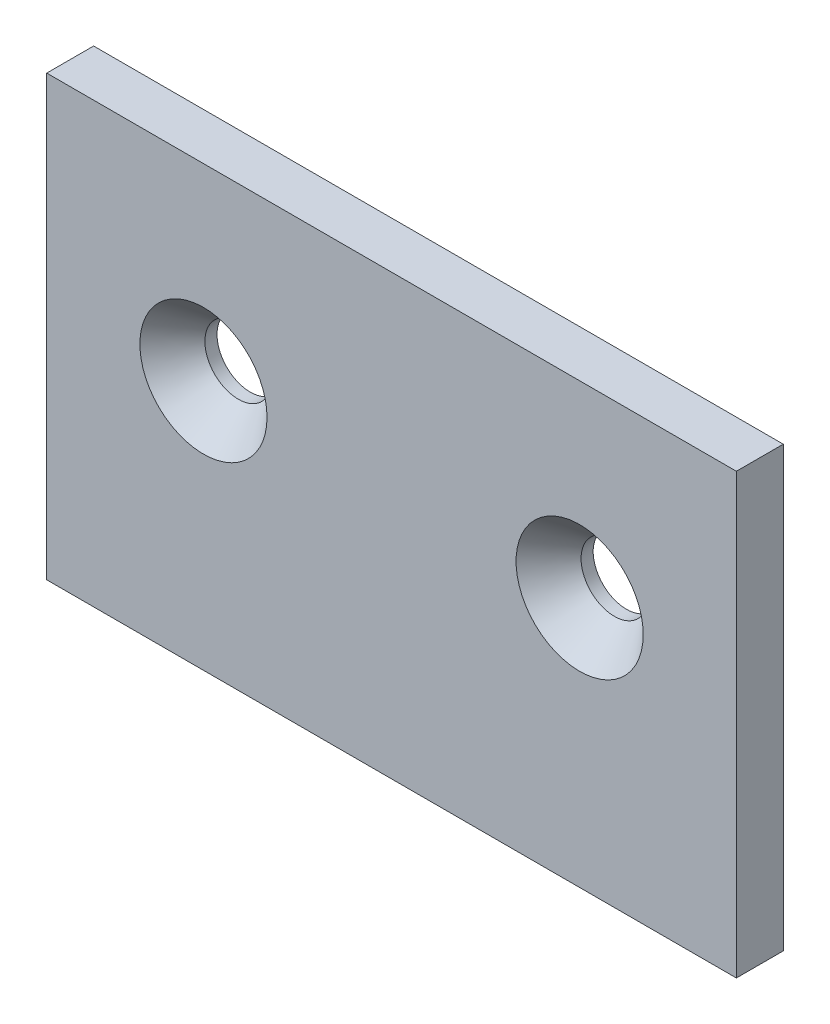
ISO-10303-21;
HEADER;
FILE_DESCRIPTION(('STEP AP214'),'2;1');
FILE_NAME('part.step','',(''),(''),'','','');
FILE_SCHEMA(('AUTOMOTIVE_DESIGN { 1 0 10303 214 1 1 1 1 }'));
ENDSEC;
DATA;
#1=APPLICATION_CONTEXT('core data for automotive mechanical design processes');
#2=APPLICATION_PROTOCOL_DEFINITION('international standard','automotive_design',2000,#1);
#3=PRODUCT_CONTEXT('',#1,'mechanical');
#4=PRODUCT('Part','Part','',(#3));
#5=PRODUCT_RELATED_PRODUCT_CATEGORY('part','',(#4));
#6=PRODUCT_DEFINITION_FORMATION('','',#4);
#7=PRODUCT_DEFINITION_CONTEXT('part definition',#1,'design');
#8=PRODUCT_DEFINITION('design','',#6,#7);
#9=PRODUCT_DEFINITION_SHAPE('','',#8);
#10=(LENGTH_UNIT() NAMED_UNIT(*) SI_UNIT(.MILLI.,.METRE.));
#11=(NAMED_UNIT(*) PLANE_ANGLE_UNIT() SI_UNIT($,.RADIAN.));
#12=(NAMED_UNIT(*) SI_UNIT($,.STERADIAN.) SOLID_ANGLE_UNIT());
#13=UNCERTAINTY_MEASURE_WITH_UNIT(LENGTH_MEASURE(1.E-05),#10,'distance_accuracy_value','');
#14=(GEOMETRIC_REPRESENTATION_CONTEXT(3) GLOBAL_UNCERTAINTY_ASSIGNED_CONTEXT((#13)) GLOBAL_UNIT_ASSIGNED_CONTEXT((#10,
#11,#12)) REPRESENTATION_CONTEXT('',''));
#15=CARTESIAN_POINT('',(0.,0.,0.));
#16=DIRECTION('',(0.,0.,1.));
#17=DIRECTION('',(1.,0.,0.));
#18=AXIS2_PLACEMENT_3D('',#15,#16,#17);
#19=CARTESIAN_POINT('',(34.925,0.,4.7498));
#20=DIRECTION('',(-1.,0.,0.));
#21=DIRECTION('',(0.,0.,1.));
#22=AXIS2_PLACEMENT_3D('',#19,#20,#21);
#23=PLANE('',#22);
#24=DIRECTION('',(0.,1.,0.));
#25=VECTOR('',#24,1.);
#26=CARTESIAN_POINT('',(34.925,0.,0.));
#27=LINE('',#26,#25);
#28=CARTESIAN_POINT('',(34.925,0.,0.));
#29=VERTEX_POINT('',#28);
#30=CARTESIAN_POINT('',(34.925,44.45,0.));
#31=VERTEX_POINT('',#30);
#32=EDGE_CURVE('E99',#29,#31,#27,.T.);
#33=ORIENTED_EDGE('',*,*,#32,.T.);
#34=DIRECTION('',(0.,0.,-1.));
#35=VECTOR('',#34,1.);
#36=CARTESIAN_POINT('',(34.925,44.45,4.7498));
#37=LINE('',#36,#35);
#38=CARTESIAN_POINT('',(34.925,44.45,4.7498));
#39=VERTEX_POINT('',#38);
#40=EDGE_CURVE('E11',#39,#31,#37,.T.);
#41=ORIENTED_EDGE('',*,*,#40,.F.);
#42=DIRECTION('',(0.,1.,0.));
#43=VECTOR('',#42,1.);
#44=CARTESIAN_POINT('',(34.925,0.,4.7498));
#45=LINE('',#44,#43);
#46=CARTESIAN_POINT('',(34.925,0.,4.7498));
#47=VERTEX_POINT('',#46);
#48=EDGE_CURVE('E87',#47,#39,#45,.T.);
#49=ORIENTED_EDGE('',*,*,#48,.F.);
#50=DIRECTION('',(0.,0.,-1.));
#51=VECTOR('',#50,1.);
#52=CARTESIAN_POINT('',(34.925,0.,4.7498));
#53=LINE('',#52,#51);
#54=EDGE_CURVE('E95',#47,#29,#53,.T.);
#55=ORIENTED_EDGE('',*,*,#54,.T.);
#56=EDGE_LOOP('',(#33,#41,#49,#55));
#57=FACE_BOUND('',#56,.T.);
#58=ADVANCED_FACE('F36',(#57),#23,.F.);
#59=CARTESIAN_POINT('',(34.925,44.45,4.7498));
#60=DIRECTION('',(0.,-1.,0.));
#61=DIRECTION('',(0.,0.,-1.));
#62=AXIS2_PLACEMENT_3D('',#59,#60,#61);
#63=PLANE('',#62);
#64=DIRECTION('',(-1.,0.,0.));
#65=VECTOR('',#64,1.);
#66=CARTESIAN_POINT('',(34.925,44.45,0.));
#67=LINE('',#66,#65);
#68=CARTESIAN_POINT('',(-34.925,44.45,0.));
#69=VERTEX_POINT('',#68);
#70=EDGE_CURVE('E91',#31,#69,#67,.T.);
#71=ORIENTED_EDGE('',*,*,#70,.T.);
#72=DIRECTION('',(0.,0.,-1.));
#73=VECTOR('',#72,1.);
#74=CARTESIAN_POINT('',(-34.925,44.45,4.7498));
#75=LINE('',#74,#73);
#76=CARTESIAN_POINT('',(-34.925,44.45,4.7498));
#77=VERTEX_POINT('',#76);
#78=EDGE_CURVE('E44',#77,#69,#75,.T.);
#79=ORIENTED_EDGE('',*,*,#78,.F.);
#80=DIRECTION('',(-1.,0.,0.));
#81=VECTOR('',#80,1.);
#82=CARTESIAN_POINT('',(34.925,44.45,4.7498));
#83=LINE('',#82,#81);
#84=EDGE_CURVE('E82',#39,#77,#83,.T.);
#85=ORIENTED_EDGE('',*,*,#84,.F.);
#86=ORIENTED_EDGE('',*,*,#40,.T.);
#87=EDGE_LOOP('',(#71,#79,#85,#86));
#88=FACE_BOUND('',#87,.T.);
#89=ADVANCED_FACE('F90',(#88),#63,.F.);
#90=CARTESIAN_POINT('',(-34.925,0.,4.7498));
#91=DIRECTION('',(1.,0.,0.));
#92=DIRECTION('',(0.,0.,-1.));
#93=AXIS2_PLACEMENT_3D('',#90,#91,#92);
#94=PLANE('',#93);
#95=DIRECTION('',(0.,-1.,0.));
#96=VECTOR('',#95,1.);
#97=CARTESIAN_POINT('',(-34.925,0.,0.));
#98=LINE('',#97,#96);
#99=CARTESIAN_POINT('',(-34.925,0.,0.));
#100=VERTEX_POINT('',#99);
#101=EDGE_CURVE('E69',#69,#100,#98,.T.);
#102=ORIENTED_EDGE('',*,*,#101,.T.);
#103=DIRECTION('',(0.,0.,-1.));
#104=VECTOR('',#103,1.);
#105=CARTESIAN_POINT('',(-34.925,0.,4.7498));
#106=LINE('',#105,#104);
#107=CARTESIAN_POINT('',(-34.925,0.,4.7498));
#108=VERTEX_POINT('',#107);
#109=EDGE_CURVE('E92',#108,#100,#106,.T.);
#110=ORIENTED_EDGE('',*,*,#109,.F.);
#111=DIRECTION('',(0.,-1.,0.));
#112=VECTOR('',#111,1.);
#113=CARTESIAN_POINT('',(-34.925,0.,4.7498));
#114=LINE('',#113,#112);
#115=EDGE_CURVE('E85',#77,#108,#114,.T.);
#116=ORIENTED_EDGE('',*,*,#115,.F.);
#117=ORIENTED_EDGE('',*,*,#78,.T.);
#118=EDGE_LOOP('',(#102,#110,#116,#117));
#119=FACE_BOUND('',#118,.T.);
#120=ADVANCED_FACE('F93',(#119),#94,.F.);
#121=CARTESIAN_POINT('',(34.925,0.,4.7498));
#122=DIRECTION('',(0.,1.,0.));
#123=DIRECTION('',(-1.,0.,0.));
#124=AXIS2_PLACEMENT_3D('',#121,#122,#123);
#125=PLANE('',#124);
#126=DIRECTION('',(1.,0.,0.));
#127=VECTOR('',#126,1.);
#128=CARTESIAN_POINT('',(34.925,0.,0.));
#129=LINE('',#128,#127);
#130=EDGE_CURVE('E75',#100,#29,#129,.T.);
#131=ORIENTED_EDGE('',*,*,#130,.T.);
#132=ORIENTED_EDGE('',*,*,#54,.F.);
#133=DIRECTION('',(1.,0.,0.));
#134=VECTOR('',#133,1.);
#135=CARTESIAN_POINT('',(34.925,0.,4.7498));
#136=LINE('',#135,#134);
#137=EDGE_CURVE('E52',#108,#47,#136,.T.);
#138=ORIENTED_EDGE('',*,*,#137,.F.);
#139=ORIENTED_EDGE('',*,*,#109,.T.);
#140=EDGE_LOOP('',(#131,#132,#138,#139));
#141=FACE_BOUND('',#140,.T.);
#142=ADVANCED_FACE('F107',(#141),#125,.F.);
#143=CARTESIAN_POINT('',(0.,0.,4.7498));
#144=DIRECTION('',(0.,0.,1.));
#145=DIRECTION('',(1.,0.,0.));
#146=AXIS2_PLACEMENT_3D('',#143,#144,#145);
#147=PLANE('',#146);
#148=CARTESIAN_POINT('',(-19.05,25.4,4.7498));
#149=DIRECTION('',(0.,0.,1.));
#150=DIRECTION('',(1.,0.,0.));
#151=AXIS2_PLACEMENT_3D('',#148,#149,#150);
#152=CIRCLE('',#151,6.4389);
#153=CARTESIAN_POINT('',(-12.6111,25.4,4.7498));
#154=VERTEX_POINT('',#153);
#155=EDGE_CURVE('E127',#154,#154,#152,.T.);
#156=ORIENTED_EDGE('',*,*,#155,.F.);
#157=EDGE_LOOP('',(#156));
#158=FACE_BOUND('',#157,.T.);
#159=CARTESIAN_POINT('',(19.05,25.4,4.7498));
#160=DIRECTION('',(0.,0.,1.));
#161=DIRECTION('',(1.,0.,0.));
#162=AXIS2_PLACEMENT_3D('',#159,#160,#161);
#163=CIRCLE('',#162,6.4389);
#164=CARTESIAN_POINT('',(25.4889,25.4,4.7498));
#165=VERTEX_POINT('',#164);
#166=EDGE_CURVE('E118',#165,#165,#163,.T.);
#167=ORIENTED_EDGE('',*,*,#166,.F.);
#168=EDGE_LOOP('',(#167));
#169=FACE_BOUND('',#168,.T.);
#170=ORIENTED_EDGE('',*,*,#48,.T.);
#171=ORIENTED_EDGE('',*,*,#84,.T.);
#172=ORIENTED_EDGE('',*,*,#115,.T.);
#173=ORIENTED_EDGE('',*,*,#137,.T.);
#174=EDGE_LOOP('',(#170,#171,#172,#173));
#175=FACE_BOUND('',#174,.T.);
#176=ADVANCED_FACE('F83',(#158,#169,#175),#147,.T.);
#177=CARTESIAN_POINT('',(0.,0.,0.));
#178=DIRECTION('',(0.,0.,1.));
#179=DIRECTION('',(1.,0.,0.));
#180=AXIS2_PLACEMENT_3D('',#177,#178,#179);
#181=PLANE('',#180);
#182=CARTESIAN_POINT('',(-19.05,25.4,0.));
#183=DIRECTION('',(0.,0.,1.));
#184=DIRECTION('',(1.,0.,0.));
#185=AXIS2_PLACEMENT_3D('',#182,#183,#184);
#186=CIRCLE('',#185,3.3782);
#187=CARTESIAN_POINT('',(-15.6718,25.4,0.));
#188=VERTEX_POINT('',#187);
#189=EDGE_CURVE('E121',#188,#188,#186,.T.);
#190=ORIENTED_EDGE('',*,*,#189,.T.);
#191=EDGE_LOOP('',(#190));
#192=FACE_BOUND('',#191,.T.);
#193=CARTESIAN_POINT('',(19.05,25.4,0.));
#194=DIRECTION('',(0.,0.,1.));
#195=DIRECTION('',(1.,0.,0.));
#196=AXIS2_PLACEMENT_3D('',#193,#194,#195);
#197=CIRCLE('',#196,3.3782);
#198=CARTESIAN_POINT('',(22.4282,25.4,0.));
#199=VERTEX_POINT('',#198);
#200=EDGE_CURVE('E102',#199,#199,#197,.T.);
#201=ORIENTED_EDGE('',*,*,#200,.T.);
#202=EDGE_LOOP('',(#201));
#203=FACE_BOUND('',#202,.T.);
#204=ORIENTED_EDGE('',*,*,#32,.F.);
#205=ORIENTED_EDGE('',*,*,#130,.F.);
#206=ORIENTED_EDGE('',*,*,#101,.F.);
#207=ORIENTED_EDGE('',*,*,#70,.F.);
#208=EDGE_LOOP('',(#204,#205,#206,#207));
#209=FACE_BOUND('',#208,.T.);
#210=ADVANCED_FACE('F110',(#192,#203,#209),#181,.F.);
#211=CARTESIAN_POINT('',(19.05,25.4,4.7498));
#212=DIRECTION('',(0.,0.,1.));
#213=DIRECTION('',(1.,0.,0.));
#214=AXIS2_PLACEMENT_3D('',#211,#212,#213);
#215=CYLINDRICAL_SURFACE('',#214,3.3782);
#216=ORIENTED_EDGE('',*,*,#200,.F.);
#217=EDGE_LOOP('',(#216));
#218=FACE_BOUND('',#217,.T.);
#219=CARTESIAN_POINT('',(19.05,25.4,1.22886741601866));
#220=DIRECTION('',(0.,0.,1.));
#221=DIRECTION('',(1.,0.,0.));
#222=AXIS2_PLACEMENT_3D('',#219,#220,#221);
#223=CIRCLE('',#222,3.3782);
#224=CARTESIAN_POINT('',(22.4282,25.4,1.22886741601866));
#225=VERTEX_POINT('',#224);
#226=EDGE_CURVE('E115',#225,#225,#223,.T.);
#227=ORIENTED_EDGE('',*,*,#226,.T.);
#228=EDGE_LOOP('',(#227));
#229=FACE_BOUND('',#228,.T.);
#230=ADVANCED_FACE('F141',(#218,#229),#215,.F.);
#231=CARTESIAN_POINT('',(19.05,25.4,4.7498));
#232=DIRECTION('',(0.,0.,1.));
#233=DIRECTION('',(1.,0.,0.));
#234=AXIS2_PLACEMENT_3D('',#231,#232,#233);
#235=CONICAL_SURFACE('',#234,6.4389,0.715584993317676);
#236=ORIENTED_EDGE('',*,*,#226,.F.);
#237=EDGE_LOOP('',(#236));
#238=FACE_BOUND('',#237,.T.);
#239=ORIENTED_EDGE('',*,*,#166,.T.);
#240=EDGE_LOOP('',(#239));
#241=FACE_BOUND('',#240,.T.);
#242=ADVANCED_FACE('F138',(#238,#241),#235,.F.);
#243=CARTESIAN_POINT('',(-19.05,25.4,4.7498));
#244=DIRECTION('',(0.,0.,1.));
#245=DIRECTION('',(1.,0.,0.));
#246=AXIS2_PLACEMENT_3D('',#243,#244,#245);
#247=CYLINDRICAL_SURFACE('',#246,3.3782);
#248=ORIENTED_EDGE('',*,*,#189,.F.);
#249=EDGE_LOOP('',(#248));
#250=FACE_BOUND('',#249,.T.);
#251=CARTESIAN_POINT('',(-19.05,25.4,1.22886741601866));
#252=DIRECTION('',(0.,0.,1.));
#253=DIRECTION('',(1.,0.,0.));
#254=AXIS2_PLACEMENT_3D('',#251,#252,#253);
#255=CIRCLE('',#254,3.3782);
#256=CARTESIAN_POINT('',(-15.6718,25.4,1.22886741601866));
#257=VERTEX_POINT('',#256);
#258=EDGE_CURVE('E124',#257,#257,#255,.T.);
#259=ORIENTED_EDGE('',*,*,#258,.T.);
#260=EDGE_LOOP('',(#259));
#261=FACE_BOUND('',#260,.T.);
#262=ADVANCED_FACE('F140',(#250,#261),#247,.F.);
#263=CARTESIAN_POINT('',(-19.05,25.4,4.7498));
#264=DIRECTION('',(0.,0.,1.));
#265=DIRECTION('',(1.,0.,0.));
#266=AXIS2_PLACEMENT_3D('',#263,#264,#265);
#267=CONICAL_SURFACE('',#266,6.4389,0.715584993317676);
#268=ORIENTED_EDGE('',*,*,#258,.F.);
#269=EDGE_LOOP('',(#268));
#270=FACE_BOUND('',#269,.T.);
#271=ORIENTED_EDGE('',*,*,#155,.T.);
#272=EDGE_LOOP('',(#271));
#273=FACE_BOUND('',#272,.T.);
#274=ADVANCED_FACE('F131',(#270,#273),#267,.F.);
#275=CLOSED_SHELL('',(#58,#89,#120,#142,#176,#210,#230,#242,#262,#274));
#276=MANIFOLD_SOLID_BREP('B2',#275);
#277=ADVANCED_BREP_SHAPE_REPRESENTATION('',(#18,#276),#14);
#278=SHAPE_DEFINITION_REPRESENTATION(#9,#277);
ENDSEC;
END-ISO-10303-21;
